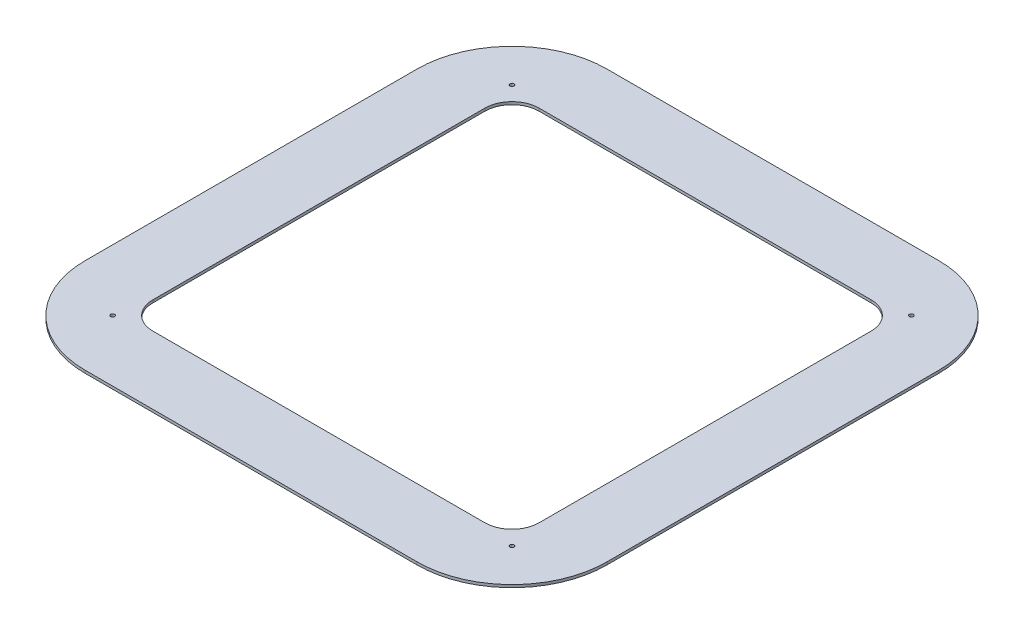
ISO-10303-21;
HEADER;
FILE_DESCRIPTION(('STEP AP214'),'2;1');
FILE_NAME('part.step','',(''),(''),'','','');
FILE_SCHEMA(('AUTOMOTIVE_DESIGN { 1 0 10303 214 1 1 1 1 }'));
ENDSEC;
DATA;
#1=APPLICATION_CONTEXT('core data for automotive mechanical design processes');
#2=APPLICATION_PROTOCOL_DEFINITION('international standard','automotive_design',2000,#1);
#3=PRODUCT_CONTEXT('',#1,'mechanical');
#4=PRODUCT('Part','Part','',(#3));
#5=PRODUCT_RELATED_PRODUCT_CATEGORY('part','',(#4));
#6=PRODUCT_DEFINITION_FORMATION('','',#4);
#7=PRODUCT_DEFINITION_CONTEXT('part definition',#1,'design');
#8=PRODUCT_DEFINITION('design','',#6,#7);
#9=PRODUCT_DEFINITION_SHAPE('','',#8);
#10=(LENGTH_UNIT() NAMED_UNIT(*) SI_UNIT(.MILLI.,.METRE.));
#11=(NAMED_UNIT(*) PLANE_ANGLE_UNIT() SI_UNIT($,.RADIAN.));
#12=(NAMED_UNIT(*) SI_UNIT($,.STERADIAN.) SOLID_ANGLE_UNIT());
#13=UNCERTAINTY_MEASURE_WITH_UNIT(LENGTH_MEASURE(1.E-05),#10,'distance_accuracy_value','');
#14=(GEOMETRIC_REPRESENTATION_CONTEXT(3) GLOBAL_UNCERTAINTY_ASSIGNED_CONTEXT((#13)) GLOBAL_UNIT_ASSIGNED_CONTEXT((#10,
#11,#12)) REPRESENTATION_CONTEXT('',''));
#15=CARTESIAN_POINT('',(0.,0.,0.));
#16=DIRECTION('',(0.,0.,1.));
#17=DIRECTION('',(1.,0.,0.));
#18=AXIS2_PLACEMENT_3D('',#15,#16,#17);
#19=CARTESIAN_POINT('',(0.,2.,0.));
#20=DIRECTION('',(0.,-1.,0.));
#21=DIRECTION('',(0.,0.,-1.));
#22=AXIS2_PLACEMENT_3D('',#19,#20,#21);
#23=PLANE('',#22);
#24=CARTESIAN_POINT('',(45.1805519803522,2.,-339.819448019648));
#25=DIRECTION('',(0.,1.,0.));
#26=DIRECTION('',(0.,0.,1.));
#27=AXIS2_PLACEMENT_3D('',#24,#25,#26);
#28=CIRCLE('',#27,1.5);
#29=CARTESIAN_POINT('',(45.1805519803522,2.,-338.319448019648));
#30=VERTEX_POINT('',#29);
#31=EDGE_CURVE('E496',#30,#30,#28,.T.);
#32=ORIENTED_EDGE('',*,*,#31,.F.);
#33=EDGE_LOOP('',(#32));
#34=FACE_BOUND('',#33,.T.);
#35=CARTESIAN_POINT('',(45.1805519803522,2.,-45.1805519803522));
#36=DIRECTION('',(0.,1.,0.));
#37=DIRECTION('',(0.,0.,1.));
#38=AXIS2_PLACEMENT_3D('',#35,#36,#37);
#39=CIRCLE('',#38,1.5);
#40=CARTESIAN_POINT('',(45.1805519803522,2.,-43.6805519803522));
#41=VERTEX_POINT('',#40);
#42=EDGE_CURVE('E494',#41,#41,#39,.F.);
#43=ORIENTED_EDGE('',*,*,#42,.T.);
#44=EDGE_LOOP('',(#43));
#45=FACE_BOUND('',#44,.T.);
#46=DIRECTION('',(0.,0.,1.));
#47=VECTOR('',#46,1.);
#48=CARTESIAN_POINT('',(0.,2.,0.));
#49=LINE('',#48,#47);
#50=CARTESIAN_POINT('',(0.,2.,-315.));
#51=VERTEX_POINT('',#50);
#52=CARTESIAN_POINT('',(0.,2.,-70.));
#53=VERTEX_POINT('',#52);
#54=EDGE_CURVE('E186',#51,#53,#49,.T.);
#55=ORIENTED_EDGE('',*,*,#54,.T.);
#56=CARTESIAN_POINT('',(70.,2.,-70.));
#57=DIRECTION('',(0.,-1.,0.));
#58=DIRECTION('',(0.,0.,-1.));
#59=AXIS2_PLACEMENT_3D('',#56,#57,#58);
#60=CIRCLE('',#59,70.);
#61=CARTESIAN_POINT('',(70.,2.,0.));
#62=VERTEX_POINT('',#61);
#63=EDGE_CURVE('E202',#53,#62,#60,.F.);
#64=ORIENTED_EDGE('',*,*,#63,.T.);
#65=DIRECTION('',(1.,0.,0.));
#66=VECTOR('',#65,1.);
#67=CARTESIAN_POINT('',(0.,2.,0.));
#68=LINE('',#67,#66);
#69=CARTESIAN_POINT('',(315.,2.,0.));
#70=VERTEX_POINT('',#69);
#71=EDGE_CURVE('E167',#62,#70,#68,.T.);
#72=ORIENTED_EDGE('',*,*,#71,.T.);
#73=CARTESIAN_POINT('',(315.,2.,-70.));
#74=DIRECTION('',(0.,-1.,0.));
#75=DIRECTION('',(0.,0.,-1.));
#76=AXIS2_PLACEMENT_3D('',#73,#74,#75);
#77=CIRCLE('',#76,70.);
#78=CARTESIAN_POINT('',(385.,2.,-70.));
#79=VERTEX_POINT('',#78);
#80=EDGE_CURVE('E196',#70,#79,#77,.F.);
#81=ORIENTED_EDGE('',*,*,#80,.T.);
#82=DIRECTION('',(0.,0.,-1.));
#83=VECTOR('',#82,1.);
#84=CARTESIAN_POINT('',(385.,2.,0.));
#85=LINE('',#84,#83);
#86=CARTESIAN_POINT('',(385.,2.,-315.));
#87=VERTEX_POINT('',#86);
#88=EDGE_CURVE('E283',#79,#87,#85,.T.);
#89=ORIENTED_EDGE('',*,*,#88,.T.);
#90=CARTESIAN_POINT('',(315.,2.,-315.));
#91=DIRECTION('',(0.,-1.,0.));
#92=DIRECTION('',(0.,0.,-1.));
#93=AXIS2_PLACEMENT_3D('',#90,#91,#92);
#94=CIRCLE('',#93,70.);
#95=CARTESIAN_POINT('',(315.,2.,-385.));
#96=VERTEX_POINT('',#95);
#97=EDGE_CURVE('E200',#87,#96,#94,.F.);
#98=ORIENTED_EDGE('',*,*,#97,.T.);
#99=DIRECTION('',(-1.,0.,0.));
#100=VECTOR('',#99,1.);
#101=CARTESIAN_POINT('',(0.,2.,-385.));
#102=LINE('',#101,#100);
#103=CARTESIAN_POINT('',(70.,2.,-385.));
#104=VERTEX_POINT('',#103);
#105=EDGE_CURVE('E187',#96,#104,#102,.T.);
#106=ORIENTED_EDGE('',*,*,#105,.T.);
#107=CARTESIAN_POINT('',(70.,2.,-315.));
#108=DIRECTION('',(0.,-1.,0.));
#109=DIRECTION('',(0.,0.,-1.));
#110=AXIS2_PLACEMENT_3D('',#107,#108,#109);
#111=CIRCLE('',#110,70.);
#112=EDGE_CURVE('E198',#104,#51,#111,.F.);
#113=ORIENTED_EDGE('',*,*,#112,.T.);
#114=EDGE_LOOP('',(#55,#64,#72,#81,#89,#98,#106,#113));
#115=FACE_BOUND('',#114,.T.);
#116=DIRECTION('',(0.,0.,1.));
#117=VECTOR('',#116,1.);
#118=CARTESIAN_POINT('',(50.,2.,-50.));
#119=LINE('',#118,#117);
#120=CARTESIAN_POINT('',(50.,2.,-315.));
#121=VERTEX_POINT('',#120);
#122=CARTESIAN_POINT('',(50.,2.,-70.));
#123=VERTEX_POINT('',#122);
#124=EDGE_CURVE('E261',#121,#123,#119,.T.);
#125=ORIENTED_EDGE('',*,*,#124,.F.);
#126=CARTESIAN_POINT('',(70.,2.,-315.));
#127=DIRECTION('',(0.,-1.,0.));
#128=DIRECTION('',(0.,0.,-1.));
#129=AXIS2_PLACEMENT_3D('',#126,#127,#128);
#130=CIRCLE('',#129,20.);
#131=CARTESIAN_POINT('',(70.,2.,-335.));
#132=VERTEX_POINT('',#131);
#133=EDGE_CURVE('E243',#121,#132,#130,.T.);
#134=ORIENTED_EDGE('',*,*,#133,.T.);
#135=DIRECTION('',(-1.,0.,0.));
#136=VECTOR('',#135,1.);
#137=CARTESIAN_POINT('',(50.,2.,-335.));
#138=LINE('',#137,#136);
#139=CARTESIAN_POINT('',(315.,2.,-335.));
#140=VERTEX_POINT('',#139);
#141=EDGE_CURVE('E180',#140,#132,#138,.T.);
#142=ORIENTED_EDGE('',*,*,#141,.F.);
#143=CARTESIAN_POINT('',(315.,2.,-315.));
#144=DIRECTION('',(0.,-1.,0.));
#145=DIRECTION('',(0.,0.,-1.));
#146=AXIS2_PLACEMENT_3D('',#143,#144,#145);
#147=CIRCLE('',#146,20.);
#148=CARTESIAN_POINT('',(335.,2.,-315.));
#149=VERTEX_POINT('',#148);
#150=EDGE_CURVE('E239',#140,#149,#147,.T.);
#151=ORIENTED_EDGE('',*,*,#150,.T.);
#152=DIRECTION('',(0.,0.,-1.));
#153=VECTOR('',#152,1.);
#154=CARTESIAN_POINT('',(335.,2.,-50.));
#155=LINE('',#154,#153);
#156=CARTESIAN_POINT('',(335.,2.,-70.));
#157=VERTEX_POINT('',#156);
#158=EDGE_CURVE('E266',#157,#149,#155,.T.);
#159=ORIENTED_EDGE('',*,*,#158,.F.);
#160=CARTESIAN_POINT('',(315.,2.,-70.));
#161=DIRECTION('',(0.,-1.,0.));
#162=DIRECTION('',(0.,0.,-1.));
#163=AXIS2_PLACEMENT_3D('',#160,#161,#162);
#164=CIRCLE('',#163,20.);
#165=CARTESIAN_POINT('',(315.,2.,-50.));
#166=VERTEX_POINT('',#165);
#167=EDGE_CURVE('E235',#157,#166,#164,.T.);
#168=ORIENTED_EDGE('',*,*,#167,.T.);
#169=DIRECTION('',(1.,0.,0.));
#170=VECTOR('',#169,1.);
#171=CARTESIAN_POINT('',(50.,2.,-50.));
#172=LINE('',#171,#170);
#173=CARTESIAN_POINT('',(70.,2.,-50.));
#174=VERTEX_POINT('',#173);
#175=EDGE_CURVE('E263',#174,#166,#172,.T.);
#176=ORIENTED_EDGE('',*,*,#175,.F.);
#177=CARTESIAN_POINT('',(70.,2.,-70.));
#178=DIRECTION('',(0.,-1.,0.));
#179=DIRECTION('',(0.,0.,-1.));
#180=AXIS2_PLACEMENT_3D('',#177,#178,#179);
#181=CIRCLE('',#180,20.);
#182=EDGE_CURVE('E11',#174,#123,#181,.T.);
#183=ORIENTED_EDGE('',*,*,#182,.T.);
#184=EDGE_LOOP('',(#125,#134,#142,#151,#159,#168,#176,#183));
#185=FACE_BOUND('',#184,.T.);
#186=CARTESIAN_POINT('',(339.819448019648,2.,-339.819448019648));
#187=DIRECTION('',(0.,1.,0.));
#188=DIRECTION('',(0.,0.,1.));
#189=AXIS2_PLACEMENT_3D('',#186,#187,#188);
#190=CIRCLE('',#189,1.50000000000002);
#191=CARTESIAN_POINT('',(339.819448019648,2.,-338.319448019648));
#192=VERTEX_POINT('',#191);
#193=EDGE_CURVE('E487',#192,#192,#190,.F.);
#194=ORIENTED_EDGE('',*,*,#193,.T.);
#195=EDGE_LOOP('',(#194));
#196=FACE_BOUND('',#195,.T.);
#197=CARTESIAN_POINT('',(339.819448019648,2.,-45.1805519803522));
#198=DIRECTION('',(0.,1.,0.));
#199=DIRECTION('',(0.,0.,1.));
#200=AXIS2_PLACEMENT_3D('',#197,#198,#199);
#201=CIRCLE('',#200,1.50000000000002);
#202=CARTESIAN_POINT('',(339.819448019648,2.,-43.6805519803522));
#203=VERTEX_POINT('',#202);
#204=EDGE_CURVE('E485',#203,#203,#201,.T.);
#205=ORIENTED_EDGE('',*,*,#204,.F.);
#206=EDGE_LOOP('',(#205));
#207=FACE_BOUND('',#206,.T.);
#208=ADVANCED_FACE('F34',(#34,#45,#115,#185,#196,#207),#23,.F.);
#209=CARTESIAN_POINT('',(0.,0.,0.));
#210=DIRECTION('',(0.,-1.,0.));
#211=DIRECTION('',(0.,0.,-1.));
#212=AXIS2_PLACEMENT_3D('',#209,#210,#211);
#213=PLANE('',#212);
#214=CARTESIAN_POINT('',(339.819448019648,0.,-339.819448019648));
#215=DIRECTION('',(0.,-1.,0.));
#216=DIRECTION('',(0.,0.,-1.));
#217=AXIS2_PLACEMENT_3D('',#214,#215,#216);
#218=CIRCLE('',#217,1.50000000000002);
#219=CARTESIAN_POINT('',(339.819448019648,0.,-341.319448019648));
#220=VERTEX_POINT('',#219);
#221=EDGE_CURVE('E490',#220,#220,#218,.T.);
#222=ORIENTED_EDGE('',*,*,#221,.F.);
#223=EDGE_LOOP('',(#222));
#224=FACE_BOUND('',#223,.T.);
#225=CARTESIAN_POINT('',(45.1805519803522,0.,-45.1805519803522));
#226=DIRECTION('',(0.,-1.,0.));
#227=DIRECTION('',(0.,0.,-1.));
#228=AXIS2_PLACEMENT_3D('',#225,#226,#227);
#229=CIRCLE('',#228,1.5);
#230=CARTESIAN_POINT('',(45.1805519803522,0.,-46.6805519803522));
#231=VERTEX_POINT('',#230);
#232=EDGE_CURVE('E271',#231,#231,#229,.T.);
#233=ORIENTED_EDGE('',*,*,#232,.F.);
#234=EDGE_LOOP('',(#233));
#235=FACE_BOUND('',#234,.T.);
#236=DIRECTION('',(1.,0.,0.));
#237=VECTOR('',#236,1.);
#238=CARTESIAN_POINT('',(0.,0.,0.));
#239=LINE('',#238,#237);
#240=CARTESIAN_POINT('',(70.,0.,0.));
#241=VERTEX_POINT('',#240);
#242=CARTESIAN_POINT('',(315.,0.,0.));
#243=VERTEX_POINT('',#242);
#244=EDGE_CURVE('E164',#241,#243,#239,.T.);
#245=ORIENTED_EDGE('',*,*,#244,.F.);
#246=CARTESIAN_POINT('',(70.,0.,-70.));
#247=DIRECTION('',(0.,-1.,0.));
#248=DIRECTION('',(0.,0.,-1.));
#249=AXIS2_PLACEMENT_3D('',#246,#247,#248);
#250=CIRCLE('',#249,70.);
#251=CARTESIAN_POINT('',(0.,0.,-70.));
#252=VERTEX_POINT('',#251);
#253=EDGE_CURVE('E147',#241,#252,#250,.T.);
#254=ORIENTED_EDGE('',*,*,#253,.T.);
#255=DIRECTION('',(0.,0.,1.));
#256=VECTOR('',#255,1.);
#257=CARTESIAN_POINT('',(0.,0.,0.));
#258=LINE('',#257,#256);
#259=CARTESIAN_POINT('',(0.,0.,-315.));
#260=VERTEX_POINT('',#259);
#261=EDGE_CURVE('E175',#260,#252,#258,.T.);
#262=ORIENTED_EDGE('',*,*,#261,.F.);
#263=CARTESIAN_POINT('',(70.,0.,-315.));
#264=DIRECTION('',(0.,-1.,0.));
#265=DIRECTION('',(0.,0.,-1.));
#266=AXIS2_PLACEMENT_3D('',#263,#264,#265);
#267=CIRCLE('',#266,70.);
#268=CARTESIAN_POINT('',(70.,0.,-385.));
#269=VERTEX_POINT('',#268);
#270=EDGE_CURVE('E190',#260,#269,#267,.T.);
#271=ORIENTED_EDGE('',*,*,#270,.T.);
#272=DIRECTION('',(-1.,0.,0.));
#273=VECTOR('',#272,1.);
#274=CARTESIAN_POINT('',(0.,0.,-385.));
#275=LINE('',#274,#273);
#276=CARTESIAN_POINT('',(315.,0.,-385.));
#277=VERTEX_POINT('',#276);
#278=EDGE_CURVE('E178',#277,#269,#275,.T.);
#279=ORIENTED_EDGE('',*,*,#278,.F.);
#280=CARTESIAN_POINT('',(315.,0.,-315.));
#281=DIRECTION('',(0.,-1.,0.));
#282=DIRECTION('',(0.,0.,-1.));
#283=AXIS2_PLACEMENT_3D('',#280,#281,#282);
#284=CIRCLE('',#283,70.);
#285=CARTESIAN_POINT('',(385.,0.,-315.));
#286=VERTEX_POINT('',#285);
#287=EDGE_CURVE('E158',#277,#286,#284,.T.);
#288=ORIENTED_EDGE('',*,*,#287,.T.);
#289=DIRECTION('',(0.,0.,-1.));
#290=VECTOR('',#289,1.);
#291=CARTESIAN_POINT('',(385.,0.,0.));
#292=LINE('',#291,#290);
#293=CARTESIAN_POINT('',(385.,0.,-70.));
#294=VERTEX_POINT('',#293);
#295=EDGE_CURVE('E174',#294,#286,#292,.T.);
#296=ORIENTED_EDGE('',*,*,#295,.F.);
#297=CARTESIAN_POINT('',(315.,0.,-70.));
#298=DIRECTION('',(0.,-1.,0.));
#299=DIRECTION('',(0.,0.,-1.));
#300=AXIS2_PLACEMENT_3D('',#297,#298,#299);
#301=CIRCLE('',#300,70.);
#302=EDGE_CURVE('E168',#294,#243,#301,.T.);
#303=ORIENTED_EDGE('',*,*,#302,.T.);
#304=EDGE_LOOP('',(#245,#254,#262,#271,#279,#288,#296,#303));
#305=FACE_BOUND('',#304,.T.);
#306=DIRECTION('',(0.,0.,-1.));
#307=VECTOR('',#306,1.);
#308=CARTESIAN_POINT('',(335.,0.,-50.));
#309=LINE('',#308,#307);
#310=CARTESIAN_POINT('',(335.,0.,-70.));
#311=VERTEX_POINT('',#310);
#312=CARTESIAN_POINT('',(335.,0.,-315.));
#313=VERTEX_POINT('',#312);
#314=EDGE_CURVE('E258',#311,#313,#309,.T.);
#315=ORIENTED_EDGE('',*,*,#314,.T.);
#316=CARTESIAN_POINT('',(315.,0.,-315.));
#317=DIRECTION('',(0.,-1.,0.));
#318=DIRECTION('',(0.,0.,-1.));
#319=AXIS2_PLACEMENT_3D('',#316,#317,#318);
#320=CIRCLE('',#319,20.);
#321=CARTESIAN_POINT('',(315.,0.,-335.));
#322=VERTEX_POINT('',#321);
#323=EDGE_CURVE('E237',#313,#322,#320,.F.);
#324=ORIENTED_EDGE('',*,*,#323,.T.);
#325=DIRECTION('',(-1.,0.,0.));
#326=VECTOR('',#325,1.);
#327=CARTESIAN_POINT('',(50.,0.,-335.));
#328=LINE('',#327,#326);
#329=CARTESIAN_POINT('',(70.,0.,-335.));
#330=VERTEX_POINT('',#329);
#331=EDGE_CURVE('E264',#322,#330,#328,.T.);
#332=ORIENTED_EDGE('',*,*,#331,.T.);
#333=CARTESIAN_POINT('',(70.,0.,-315.));
#334=DIRECTION('',(0.,-1.,0.));
#335=DIRECTION('',(0.,0.,-1.));
#336=AXIS2_PLACEMENT_3D('',#333,#334,#335);
#337=CIRCLE('',#336,20.);
#338=CARTESIAN_POINT('',(50.,0.,-315.));
#339=VERTEX_POINT('',#338);
#340=EDGE_CURVE('E241',#330,#339,#337,.F.);
#341=ORIENTED_EDGE('',*,*,#340,.T.);
#342=DIRECTION('',(0.,0.,1.));
#343=VECTOR('',#342,1.);
#344=CARTESIAN_POINT('',(50.,0.,-50.));
#345=LINE('',#344,#343);
#346=CARTESIAN_POINT('',(50.,0.,-70.));
#347=VERTEX_POINT('',#346);
#348=EDGE_CURVE('E250',#339,#347,#345,.T.);
#349=ORIENTED_EDGE('',*,*,#348,.T.);
#350=CARTESIAN_POINT('',(70.,0.,-70.));
#351=DIRECTION('',(0.,-1.,0.));
#352=DIRECTION('',(0.,0.,-1.));
#353=AXIS2_PLACEMENT_3D('',#350,#351,#352);
#354=CIRCLE('',#353,20.);
#355=CARTESIAN_POINT('',(70.,0.,-50.));
#356=VERTEX_POINT('',#355);
#357=EDGE_CURVE('E42',#347,#356,#354,.F.);
#358=ORIENTED_EDGE('',*,*,#357,.T.);
#359=DIRECTION('',(1.,0.,0.));
#360=VECTOR('',#359,1.);
#361=CARTESIAN_POINT('',(50.,0.,-50.));
#362=LINE('',#361,#360);
#363=CARTESIAN_POINT('',(315.,0.,-50.));
#364=VERTEX_POINT('',#363);
#365=EDGE_CURVE('E249',#356,#364,#362,.T.);
#366=ORIENTED_EDGE('',*,*,#365,.T.);
#367=CARTESIAN_POINT('',(315.,0.,-70.));
#368=DIRECTION('',(0.,-1.,0.));
#369=DIRECTION('',(0.,0.,-1.));
#370=AXIS2_PLACEMENT_3D('',#367,#368,#369);
#371=CIRCLE('',#370,20.);
#372=EDGE_CURVE('E233',#364,#311,#371,.F.);
#373=ORIENTED_EDGE('',*,*,#372,.T.);
#374=EDGE_LOOP('',(#315,#324,#332,#341,#349,#358,#366,#373));
#375=FACE_BOUND('',#374,.T.);
#376=CARTESIAN_POINT('',(45.1805519803522,0.,-339.819448019648));
#377=DIRECTION('',(0.,-1.,0.));
#378=DIRECTION('',(0.,0.,-1.));
#379=AXIS2_PLACEMENT_3D('',#376,#377,#378);
#380=CIRCLE('',#379,1.5);
#381=CARTESIAN_POINT('',(45.1805519803522,0.,-341.319448019648));
#382=VERTEX_POINT('',#381);
#383=EDGE_CURVE('E500',#382,#382,#380,.F.);
#384=ORIENTED_EDGE('',*,*,#383,.T.);
#385=EDGE_LOOP('',(#384));
#386=FACE_BOUND('',#385,.T.);
#387=CARTESIAN_POINT('',(339.819448019648,0.,-45.1805519803522));
#388=DIRECTION('',(0.,-1.,0.));
#389=DIRECTION('',(0.,0.,-1.));
#390=AXIS2_PLACEMENT_3D('',#387,#388,#389);
#391=CIRCLE('',#390,1.50000000000002);
#392=CARTESIAN_POINT('',(339.819448019648,0.,-46.6805519803522));
#393=VERTEX_POINT('',#392);
#394=EDGE_CURVE('E482',#393,#393,#391,.F.);
#395=ORIENTED_EDGE('',*,*,#394,.T.);
#396=EDGE_LOOP('',(#395));
#397=FACE_BOUND('',#396,.T.);
#398=ADVANCED_FACE('F171',(#224,#235,#305,#375,#386,#397),#213,.T.);
#399=CARTESIAN_POINT('',(0.,2.,0.));
#400=DIRECTION('',(1.,0.,0.));
#401=DIRECTION('',(0.,0.,-1.));
#402=AXIS2_PLACEMENT_3D('',#399,#400,#401);
#403=PLANE('',#402);
#404=ORIENTED_EDGE('',*,*,#261,.T.);
#405=DIRECTION('',(0.,-1.,0.));
#406=VECTOR('',#405,1.);
#407=CARTESIAN_POINT('',(0.,2.,-70.));
#408=LINE('',#407,#406);
#409=EDGE_CURVE('E152',#252,#53,#408,.F.);
#410=ORIENTED_EDGE('',*,*,#409,.T.);
#411=ORIENTED_EDGE('',*,*,#54,.F.);
#412=DIRECTION('',(0.,-1.,0.));
#413=VECTOR('',#412,1.);
#414=CARTESIAN_POINT('',(0.,2.,-315.));
#415=LINE('',#414,#413);
#416=EDGE_CURVE('E157',#51,#260,#415,.T.);
#417=ORIENTED_EDGE('',*,*,#416,.T.);
#418=EDGE_LOOP('',(#404,#410,#411,#417));
#419=FACE_BOUND('',#418,.T.);
#420=ADVANCED_FACE('F298',(#419),#403,.F.);
#421=CARTESIAN_POINT('',(0.,2.,0.));
#422=DIRECTION('',(0.,0.,-1.));
#423=DIRECTION('',(-1.,0.,0.));
#424=AXIS2_PLACEMENT_3D('',#421,#422,#423);
#425=PLANE('',#424);
#426=ORIENTED_EDGE('',*,*,#71,.F.);
#427=DIRECTION('',(0.,-1.,0.));
#428=VECTOR('',#427,1.);
#429=CARTESIAN_POINT('',(70.,2.,0.));
#430=LINE('',#429,#428);
#431=EDGE_CURVE('E151',#62,#241,#430,.T.);
#432=ORIENTED_EDGE('',*,*,#431,.T.);
#433=ORIENTED_EDGE('',*,*,#244,.T.);
#434=DIRECTION('',(0.,-1.,0.));
#435=VECTOR('',#434,1.);
#436=CARTESIAN_POINT('',(315.,2.,0.));
#437=LINE('',#436,#435);
#438=EDGE_CURVE('E169',#243,#70,#437,.F.);
#439=ORIENTED_EDGE('',*,*,#438,.T.);
#440=EDGE_LOOP('',(#426,#432,#433,#439));
#441=FACE_BOUND('',#440,.T.);
#442=ADVANCED_FACE('F163',(#441),#425,.F.);
#443=CARTESIAN_POINT('',(385.,2.,0.));
#444=DIRECTION('',(-1.,0.,0.));
#445=DIRECTION('',(0.,0.,1.));
#446=AXIS2_PLACEMENT_3D('',#443,#444,#445);
#447=PLANE('',#446);
#448=ORIENTED_EDGE('',*,*,#295,.T.);
#449=DIRECTION('',(0.,-1.,0.));
#450=VECTOR('',#449,1.);
#451=CARTESIAN_POINT('',(385.,2.,-315.));
#452=LINE('',#451,#450);
#453=EDGE_CURVE('E212',#286,#87,#452,.F.);
#454=ORIENTED_EDGE('',*,*,#453,.T.);
#455=ORIENTED_EDGE('',*,*,#88,.F.);
#456=DIRECTION('',(0.,-1.,0.));
#457=VECTOR('',#456,1.);
#458=CARTESIAN_POINT('',(385.,2.,-70.));
#459=LINE('',#458,#457);
#460=EDGE_CURVE('E209',#79,#294,#459,.T.);
#461=ORIENTED_EDGE('',*,*,#460,.T.);
#462=EDGE_LOOP('',(#448,#454,#455,#461));
#463=FACE_BOUND('',#462,.T.);
#464=ADVANCED_FACE('F305',(#463),#447,.F.);
#465=CARTESIAN_POINT('',(0.,2.,-385.));
#466=DIRECTION('',(0.,0.,1.));
#467=DIRECTION('',(1.,0.,0.));
#468=AXIS2_PLACEMENT_3D('',#465,#466,#467);
#469=PLANE('',#468);
#470=ORIENTED_EDGE('',*,*,#105,.F.);
#471=DIRECTION('',(0.,-1.,0.));
#472=VECTOR('',#471,1.);
#473=CARTESIAN_POINT('',(315.,2.,-385.));
#474=LINE('',#473,#472);
#475=EDGE_CURVE('E206',#96,#277,#474,.T.);
#476=ORIENTED_EDGE('',*,*,#475,.T.);
#477=ORIENTED_EDGE('',*,*,#278,.T.);
#478=DIRECTION('',(0.,-1.,0.));
#479=VECTOR('',#478,1.);
#480=CARTESIAN_POINT('',(70.,2.,-385.));
#481=LINE('',#480,#479);
#482=EDGE_CURVE('E204',#269,#104,#481,.F.);
#483=ORIENTED_EDGE('',*,*,#482,.T.);
#484=EDGE_LOOP('',(#470,#476,#477,#483));
#485=FACE_BOUND('',#484,.T.);
#486=ADVANCED_FACE('F300',(#485),#469,.F.);
#487=CARTESIAN_POINT('',(50.,2.,-50.));
#488=DIRECTION('',(1.,0.,0.));
#489=DIRECTION('',(0.,0.,-1.));
#490=AXIS2_PLACEMENT_3D('',#487,#488,#489);
#491=PLANE('',#490);
#492=ORIENTED_EDGE('',*,*,#348,.F.);
#493=DIRECTION('',(0.,-1.,0.));
#494=VECTOR('',#493,1.);
#495=CARTESIAN_POINT('',(50.,2.,-315.));
#496=LINE('',#495,#494);
#497=EDGE_CURVE('E54',#339,#121,#496,.F.);
#498=ORIENTED_EDGE('',*,*,#497,.T.);
#499=ORIENTED_EDGE('',*,*,#124,.T.);
#500=DIRECTION('',(0.,-1.,0.));
#501=VECTOR('',#500,1.);
#502=CARTESIAN_POINT('',(50.,0.,-70.));
#503=LINE('',#502,#501);
#504=EDGE_CURVE('E229',#123,#347,#503,.T.);
#505=ORIENTED_EDGE('',*,*,#504,.T.);
#506=EDGE_LOOP('',(#492,#498,#499,#505));
#507=FACE_BOUND('',#506,.T.);
#508=ADVANCED_FACE('F260',(#507),#491,.T.);
#509=CARTESIAN_POINT('',(50.,2.,-50.));
#510=DIRECTION('',(0.,0.,-1.));
#511=DIRECTION('',(-1.,0.,0.));
#512=AXIS2_PLACEMENT_3D('',#509,#510,#511);
#513=PLANE('',#512);
#514=ORIENTED_EDGE('',*,*,#175,.T.);
#515=DIRECTION('',(0.,-1.,0.));
#516=VECTOR('',#515,1.);
#517=CARTESIAN_POINT('',(315.,0.,-50.));
#518=LINE('',#517,#516);
#519=EDGE_CURVE('E216',#166,#364,#518,.T.);
#520=ORIENTED_EDGE('',*,*,#519,.T.);
#521=ORIENTED_EDGE('',*,*,#365,.F.);
#522=DIRECTION('',(0.,-1.,0.));
#523=VECTOR('',#522,1.);
#524=CARTESIAN_POINT('',(70.,2.,-50.));
#525=LINE('',#524,#523);
#526=EDGE_CURVE('E214',#356,#174,#525,.F.);
#527=ORIENTED_EDGE('',*,*,#526,.T.);
#528=EDGE_LOOP('',(#514,#520,#521,#527));
#529=FACE_BOUND('',#528,.T.);
#530=ADVANCED_FACE('F256',(#529),#513,.T.);
#531=CARTESIAN_POINT('',(335.,2.,-50.));
#532=DIRECTION('',(-1.,0.,0.));
#533=DIRECTION('',(0.,0.,1.));
#534=AXIS2_PLACEMENT_3D('',#531,#532,#533);
#535=PLANE('',#534);
#536=ORIENTED_EDGE('',*,*,#314,.F.);
#537=DIRECTION('',(0.,-1.,0.));
#538=VECTOR('',#537,1.);
#539=CARTESIAN_POINT('',(335.,2.,-70.));
#540=LINE('',#539,#538);
#541=EDGE_CURVE('E222',#311,#157,#540,.F.);
#542=ORIENTED_EDGE('',*,*,#541,.T.);
#543=ORIENTED_EDGE('',*,*,#158,.T.);
#544=DIRECTION('',(0.,-1.,0.));
#545=VECTOR('',#544,1.);
#546=CARTESIAN_POINT('',(335.,0.,-315.));
#547=LINE('',#546,#545);
#548=EDGE_CURVE('E219',#149,#313,#547,.T.);
#549=ORIENTED_EDGE('',*,*,#548,.T.);
#550=EDGE_LOOP('',(#536,#542,#543,#549));
#551=FACE_BOUND('',#550,.T.);
#552=ADVANCED_FACE('F378',(#551),#535,.T.);
#553=CARTESIAN_POINT('',(50.,2.,-335.));
#554=DIRECTION('',(0.,0.,1.));
#555=DIRECTION('',(1.,0.,0.));
#556=AXIS2_PLACEMENT_3D('',#553,#554,#555);
#557=PLANE('',#556);
#558=ORIENTED_EDGE('',*,*,#331,.F.);
#559=DIRECTION('',(0.,-1.,0.));
#560=VECTOR('',#559,1.);
#561=CARTESIAN_POINT('',(315.,2.,-335.));
#562=LINE('',#561,#560);
#563=EDGE_CURVE('E227',#322,#140,#562,.F.);
#564=ORIENTED_EDGE('',*,*,#563,.T.);
#565=ORIENTED_EDGE('',*,*,#141,.T.);
#566=DIRECTION('',(0.,-1.,0.));
#567=VECTOR('',#566,1.);
#568=CARTESIAN_POINT('',(70.,0.,-335.));
#569=LINE('',#568,#567);
#570=EDGE_CURVE('E224',#132,#330,#569,.T.);
#571=ORIENTED_EDGE('',*,*,#570,.T.);
#572=EDGE_LOOP('',(#558,#564,#565,#571));
#573=FACE_BOUND('',#572,.T.);
#574=ADVANCED_FACE('F345',(#573),#557,.T.);
#575=CARTESIAN_POINT('',(70.,2.,-70.));
#576=DIRECTION('',(0.,-1.,0.));
#577=DIRECTION('',(0.,0.,-1.));
#578=AXIS2_PLACEMENT_3D('',#575,#576,#577);
#579=CYLINDRICAL_SURFACE('',#578,70.);
#580=ORIENTED_EDGE('',*,*,#63,.F.);
#581=ORIENTED_EDGE('',*,*,#409,.F.);
#582=ORIENTED_EDGE('',*,*,#253,.F.);
#583=ORIENTED_EDGE('',*,*,#431,.F.);
#584=EDGE_LOOP('',(#580,#581,#582,#583));
#585=FACE_BOUND('',#584,.T.);
#586=ADVANCED_FACE('F150',(#585),#579,.T.);
#587=CARTESIAN_POINT('',(315.,2.,-315.));
#588=DIRECTION('',(0.,-1.,0.));
#589=DIRECTION('',(0.,0.,-1.));
#590=AXIS2_PLACEMENT_3D('',#587,#588,#589);
#591=CYLINDRICAL_SURFACE('',#590,70.);
#592=ORIENTED_EDGE('',*,*,#97,.F.);
#593=ORIENTED_EDGE('',*,*,#453,.F.);
#594=ORIENTED_EDGE('',*,*,#287,.F.);
#595=ORIENTED_EDGE('',*,*,#475,.F.);
#596=EDGE_LOOP('',(#592,#593,#594,#595));
#597=FACE_BOUND('',#596,.T.);
#598=ADVANCED_FACE('F302',(#597),#591,.T.);
#599=CARTESIAN_POINT('',(70.,2.,-315.));
#600=DIRECTION('',(0.,-1.,0.));
#601=DIRECTION('',(0.,0.,-1.));
#602=AXIS2_PLACEMENT_3D('',#599,#600,#601);
#603=CYLINDRICAL_SURFACE('',#602,70.);
#604=ORIENTED_EDGE('',*,*,#112,.F.);
#605=ORIENTED_EDGE('',*,*,#482,.F.);
#606=ORIENTED_EDGE('',*,*,#270,.F.);
#607=ORIENTED_EDGE('',*,*,#416,.F.);
#608=EDGE_LOOP('',(#604,#605,#606,#607));
#609=FACE_BOUND('',#608,.T.);
#610=ADVANCED_FACE('F296',(#609),#603,.T.);
#611=CARTESIAN_POINT('',(315.,2.,-70.));
#612=DIRECTION('',(0.,-1.,0.));
#613=DIRECTION('',(0.,0.,-1.));
#614=AXIS2_PLACEMENT_3D('',#611,#612,#613);
#615=CYLINDRICAL_SURFACE('',#614,70.);
#616=ORIENTED_EDGE('',*,*,#80,.F.);
#617=ORIENTED_EDGE('',*,*,#438,.F.);
#618=ORIENTED_EDGE('',*,*,#302,.F.);
#619=ORIENTED_EDGE('',*,*,#460,.F.);
#620=EDGE_LOOP('',(#616,#617,#618,#619));
#621=FACE_BOUND('',#620,.T.);
#622=ADVANCED_FACE('F310',(#621),#615,.T.);
#623=CARTESIAN_POINT('',(315.,2.,-70.));
#624=DIRECTION('',(0.,1.,0.));
#625=DIRECTION('',(0.,0.,1.));
#626=AXIS2_PLACEMENT_3D('',#623,#624,#625);
#627=CYLINDRICAL_SURFACE('',#626,20.);
#628=ORIENTED_EDGE('',*,*,#167,.F.);
#629=ORIENTED_EDGE('',*,*,#541,.F.);
#630=ORIENTED_EDGE('',*,*,#372,.F.);
#631=ORIENTED_EDGE('',*,*,#519,.F.);
#632=EDGE_LOOP('',(#628,#629,#630,#631));
#633=FACE_BOUND('',#632,.T.);
#634=ADVANCED_FACE('F312',(#633),#627,.F.);
#635=CARTESIAN_POINT('',(315.,2.,-315.));
#636=DIRECTION('',(0.,1.,0.));
#637=DIRECTION('',(0.,0.,1.));
#638=AXIS2_PLACEMENT_3D('',#635,#636,#637);
#639=CYLINDRICAL_SURFACE('',#638,20.);
#640=ORIENTED_EDGE('',*,*,#150,.F.);
#641=ORIENTED_EDGE('',*,*,#563,.F.);
#642=ORIENTED_EDGE('',*,*,#323,.F.);
#643=ORIENTED_EDGE('',*,*,#548,.F.);
#644=EDGE_LOOP('',(#640,#641,#642,#643));
#645=FACE_BOUND('',#644,.T.);
#646=ADVANCED_FACE('F318',(#645),#639,.F.);
#647=CARTESIAN_POINT('',(70.,2.,-315.));
#648=DIRECTION('',(0.,1.,0.));
#649=DIRECTION('',(0.,0.,1.));
#650=AXIS2_PLACEMENT_3D('',#647,#648,#649);
#651=CYLINDRICAL_SURFACE('',#650,20.);
#652=ORIENTED_EDGE('',*,*,#133,.F.);
#653=ORIENTED_EDGE('',*,*,#497,.F.);
#654=ORIENTED_EDGE('',*,*,#340,.F.);
#655=ORIENTED_EDGE('',*,*,#570,.F.);
#656=EDGE_LOOP('',(#652,#653,#654,#655));
#657=FACE_BOUND('',#656,.T.);
#658=ADVANCED_FACE('F409',(#657),#651,.F.);
#659=CARTESIAN_POINT('',(70.,2.,-70.));
#660=DIRECTION('',(0.,1.,0.));
#661=DIRECTION('',(0.,0.,1.));
#662=AXIS2_PLACEMENT_3D('',#659,#660,#661);
#663=CYLINDRICAL_SURFACE('',#662,20.);
#664=ORIENTED_EDGE('',*,*,#182,.F.);
#665=ORIENTED_EDGE('',*,*,#526,.F.);
#666=ORIENTED_EDGE('',*,*,#357,.F.);
#667=ORIENTED_EDGE('',*,*,#504,.F.);
#668=EDGE_LOOP('',(#664,#665,#666,#667));
#669=FACE_BOUND('',#668,.T.);
#670=ADVANCED_FACE('F36',(#669),#663,.F.);
#671=CARTESIAN_POINT('',(45.1805519803522,-0.00100000000000013,-45.1805519803522));
#672=DIRECTION('',(0.,1.,0.));
#673=DIRECTION('',(0.,0.,1.));
#674=AXIS2_PLACEMENT_3D('',#671,#672,#673);
#675=CYLINDRICAL_SURFACE('',#674,1.5);
#676=ORIENTED_EDGE('',*,*,#232,.T.);
#677=EDGE_LOOP('',(#676));
#678=FACE_BOUND('',#677,.T.);
#679=ORIENTED_EDGE('',*,*,#42,.F.);
#680=EDGE_LOOP('',(#679));
#681=FACE_BOUND('',#680,.T.);
#682=ADVANCED_FACE('F426',(#678,#681),#675,.F.);
#683=CARTESIAN_POINT('',(45.1805519803522,-0.00100000000000013,-339.819448019648));
#684=DIRECTION('',(0.,1.,0.));
#685=DIRECTION('',(0.,0.,1.));
#686=AXIS2_PLACEMENT_3D('',#683,#684,#685);
#687=CYLINDRICAL_SURFACE('',#686,1.5);
#688=ORIENTED_EDGE('',*,*,#383,.F.);
#689=EDGE_LOOP('',(#688));
#690=FACE_BOUND('',#689,.T.);
#691=ORIENTED_EDGE('',*,*,#31,.T.);
#692=EDGE_LOOP('',(#691));
#693=FACE_BOUND('',#692,.T.);
#694=ADVANCED_FACE('F445',(#690,#693),#687,.F.);
#695=CARTESIAN_POINT('',(339.819448019648,-0.00100000000000013,-339.819448019648));
#696=DIRECTION('',(0.,1.,0.));
#697=DIRECTION('',(0.,0.,1.));
#698=AXIS2_PLACEMENT_3D('',#695,#696,#697);
#699=CYLINDRICAL_SURFACE('',#698,1.50000000000002);
#700=ORIENTED_EDGE('',*,*,#221,.T.);
#701=EDGE_LOOP('',(#700));
#702=FACE_BOUND('',#701,.T.);
#703=ORIENTED_EDGE('',*,*,#193,.F.);
#704=EDGE_LOOP('',(#703));
#705=FACE_BOUND('',#704,.T.);
#706=ADVANCED_FACE('F455',(#702,#705),#699,.F.);
#707=CARTESIAN_POINT('',(339.819448019648,-0.00100000000000013,-45.1805519803522));
#708=DIRECTION('',(0.,1.,0.));
#709=DIRECTION('',(0.,0.,1.));
#710=AXIS2_PLACEMENT_3D('',#707,#708,#709);
#711=CYLINDRICAL_SURFACE('',#710,1.50000000000002);
#712=ORIENTED_EDGE('',*,*,#394,.F.);
#713=EDGE_LOOP('',(#712));
#714=FACE_BOUND('',#713,.T.);
#715=ORIENTED_EDGE('',*,*,#204,.T.);
#716=EDGE_LOOP('',(#715));
#717=FACE_BOUND('',#716,.T.);
#718=ADVANCED_FACE('F465',(#714,#717),#711,.F.);
#719=CLOSED_SHELL('',(#208,#398,#420,#442,#464,#486,#508,#530,#552,#574,#586,#598,#610,#622,
#634,#646,#658,#670,#682,#694,#706,#718));
#720=MANIFOLD_SOLID_BREP('B2',#719);
#721=ADVANCED_BREP_SHAPE_REPRESENTATION('',(#18,#720),#14);
#722=SHAPE_DEFINITION_REPRESENTATION(#9,#721);
ENDSEC;
END-ISO-10303-21;
